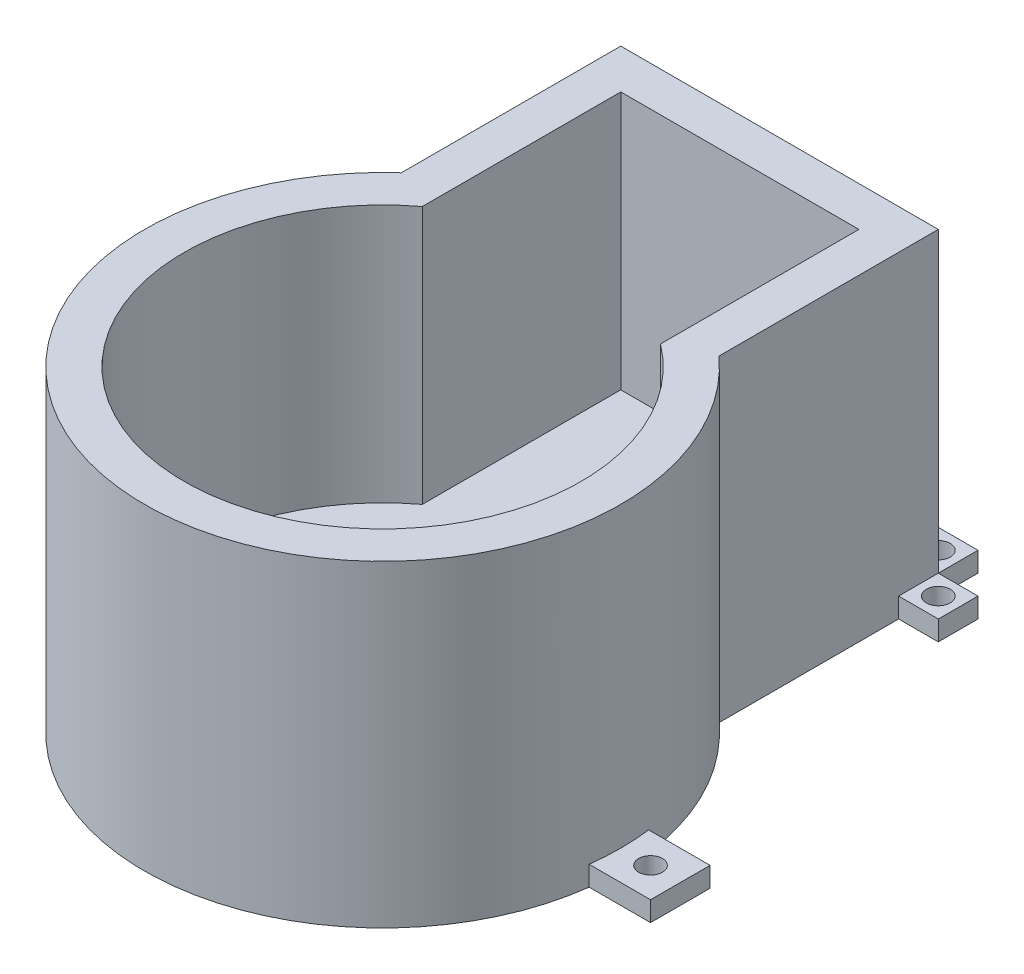
ISO-10303-21;
HEADER;
FILE_DESCRIPTION(('STEP AP214'),'2;1');
FILE_NAME('part.step','',(''),(''),'','','');
FILE_SCHEMA(('AUTOMOTIVE_DESIGN { 1 0 10303 214 1 1 1 1 }'));
ENDSEC;
DATA;
#1=APPLICATION_CONTEXT('core data for automotive mechanical design processes');
#2=APPLICATION_PROTOCOL_DEFINITION('international standard','automotive_design',2000,#1);
#3=PRODUCT_CONTEXT('',#1,'mechanical');
#4=PRODUCT('Part','Part','',(#3));
#5=PRODUCT_RELATED_PRODUCT_CATEGORY('part','',(#4));
#6=PRODUCT_DEFINITION_FORMATION('','',#4);
#7=PRODUCT_DEFINITION_CONTEXT('part definition',#1,'design');
#8=PRODUCT_DEFINITION('design','',#6,#7);
#9=PRODUCT_DEFINITION_SHAPE('','',#8);
#10=(LENGTH_UNIT() NAMED_UNIT(*) SI_UNIT(.MILLI.,.METRE.));
#11=(NAMED_UNIT(*) PLANE_ANGLE_UNIT() SI_UNIT($,.RADIAN.));
#12=(NAMED_UNIT(*) SI_UNIT($,.STERADIAN.) SOLID_ANGLE_UNIT());
#13=UNCERTAINTY_MEASURE_WITH_UNIT(LENGTH_MEASURE(1.E-05),#10,'distance_accuracy_value','');
#14=(GEOMETRIC_REPRESENTATION_CONTEXT(3) GLOBAL_UNCERTAINTY_ASSIGNED_CONTEXT((#13)) GLOBAL_UNIT_ASSIGNED_CONTEXT((#10,
#11,#12)) REPRESENTATION_CONTEXT('',''));
#15=CARTESIAN_POINT('',(0.,0.,0.));
#16=DIRECTION('',(0.,0.,1.));
#17=DIRECTION('',(1.,0.,0.));
#18=AXIS2_PLACEMENT_3D('',#15,#16,#17);
#19=CARTESIAN_POINT('',(40.,80.,0.));
#20=DIRECTION('',(1.,0.,0.));
#21=DIRECTION('',(0.,0.,-1.));
#22=AXIS2_PLACEMENT_3D('',#19,#20,#21);
#23=PLANE('',#22);
#24=DIRECTION('',(0.,0.,1.));
#25=VECTOR('',#24,1.);
#26=CARTESIAN_POINT('',(40.,5.,0.));
#27=LINE('',#26,#25);
#28=CARTESIAN_POINT('',(40.,5.,-50.));
#29=VERTEX_POINT('',#28);
#30=CARTESIAN_POINT('',(40.,5.,-40.));
#31=VERTEX_POINT('',#30);
#32=EDGE_CURVE('E247',#29,#31,#27,.T.);
#33=ORIENTED_EDGE('',*,*,#32,.T.);
#34=DIRECTION('',(0.,-1.,0.));
#35=VECTOR('',#34,1.);
#36=CARTESIAN_POINT('',(40.,5.,-40.));
#37=LINE('',#36,#35);
#38=CARTESIAN_POINT('',(40.,0.,-40.));
#39=VERTEX_POINT('',#38);
#40=EDGE_CURVE('E236',#31,#39,#37,.T.);
#41=ORIENTED_EDGE('',*,*,#40,.T.);
#42=DIRECTION('',(0.,0.,1.));
#43=VECTOR('',#42,1.);
#44=CARTESIAN_POINT('',(40.,0.,0.));
#45=LINE('',#44,#43);
#46=CARTESIAN_POINT('',(40.,0.,-50.));
#47=VERTEX_POINT('',#46);
#48=EDGE_CURVE('E244',#47,#39,#45,.T.);
#49=ORIENTED_EDGE('',*,*,#48,.F.);
#50=DIRECTION('',(0.,-1.,0.));
#51=VECTOR('',#50,1.);
#52=CARTESIAN_POINT('',(40.,5.,-50.));
#53=LINE('',#52,#51);
#54=EDGE_CURVE('E606',#29,#47,#53,.T.);
#55=ORIENTED_EDGE('',*,*,#54,.F.);
#56=EDGE_LOOP('',(#33,#41,#49,#55));
#57=FACE_BOUND('',#56,.T.);
#58=ADVANCED_FACE('F38',(#57),#23,.T.);
#59=CARTESIAN_POINT('',(40.,0.,-30.));
#60=VERTEX_POINT('',#59);
#61=CARTESIAN_POINT('',(40.,0.,15.2786404500042));
#62=VERTEX_POINT('',#61);
#63=EDGE_CURVE('E258',#60,#62,#45,.T.);
#64=ORIENTED_EDGE('',*,*,#63,.F.);
#65=DIRECTION('',(0.,-1.,0.));
#66=VECTOR('',#65,1.);
#67=CARTESIAN_POINT('',(40.,5.,-30.));
#68=LINE('',#67,#66);
#69=CARTESIAN_POINT('',(40.,5.,-30.));
#70=VERTEX_POINT('',#69);
#71=EDGE_CURVE('E311',#70,#60,#68,.T.);
#72=ORIENTED_EDGE('',*,*,#71,.F.);
#73=DIRECTION('',(0.,0.,1.));
#74=VECTOR('',#73,1.);
#75=CARTESIAN_POINT('',(40.,5.,0.));
#76=LINE('',#75,#74);
#77=EDGE_CURVE('E293',#31,#70,#76,.T.);
#78=ORIENTED_EDGE('',*,*,#77,.F.);
#79=DIRECTION('',(0.,-1.,0.));
#80=VECTOR('',#79,1.);
#81=CARTESIAN_POINT('',(40.,80.,-40.));
#82=LINE('',#81,#80);
#83=CARTESIAN_POINT('',(40.,80.,-40.));
#84=VERTEX_POINT('',#83);
#85=EDGE_CURVE('E46',#84,#31,#82,.T.);
#86=ORIENTED_EDGE('',*,*,#85,.F.);
#87=DIRECTION('',(0.,0.,1.));
#88=VECTOR('',#87,1.);
#89=CARTESIAN_POINT('',(40.,80.,0.));
#90=LINE('',#89,#88);
#91=CARTESIAN_POINT('',(40.,80.,15.2786404500042));
#92=VERTEX_POINT('',#91);
#93=EDGE_CURVE('E291',#84,#92,#90,.T.);
#94=ORIENTED_EDGE('',*,*,#93,.T.);
#95=DIRECTION('',(0.,-1.,0.));
#96=VECTOR('',#95,1.);
#97=CARTESIAN_POINT('',(40.,80.,15.2786404500042));
#98=LINE('',#97,#96);
#99=EDGE_CURVE('E11',#92,#62,#98,.T.);
#100=ORIENTED_EDGE('',*,*,#99,.T.);
#101=EDGE_LOOP('',(#64,#72,#78,#86,#94,#100));
#102=FACE_BOUND('',#101,.T.);
#103=ADVANCED_FACE('F290',(#102),#23,.T.);
#104=CARTESIAN_POINT('',(0.,80.,-40.));
#105=DIRECTION('',(0.,0.,-1.));
#106=DIRECTION('',(-1.,0.,0.));
#107=AXIS2_PLACEMENT_3D('',#104,#105,#106);
#108=PLANE('',#107);
#109=DIRECTION('',(1.,0.,0.));
#110=VECTOR('',#109,1.);
#111=CARTESIAN_POINT('',(0.,5.,-40.));
#112=LINE('',#111,#110);
#113=CARTESIAN_POINT('',(-50.,5.,-40.));
#114=VERTEX_POINT('',#113);
#115=CARTESIAN_POINT('',(-40.,5.,-40.));
#116=VERTEX_POINT('',#115);
#117=EDGE_CURVE('E657',#114,#116,#112,.T.);
#118=ORIENTED_EDGE('',*,*,#117,.T.);
#119=DIRECTION('',(0.,-1.,0.));
#120=VECTOR('',#119,1.);
#121=CARTESIAN_POINT('',(-40.,5.,-40.));
#122=LINE('',#121,#120);
#123=CARTESIAN_POINT('',(-40.,0.,-40.));
#124=VERTEX_POINT('',#123);
#125=EDGE_CURVE('E620',#116,#124,#122,.T.);
#126=ORIENTED_EDGE('',*,*,#125,.T.);
#127=DIRECTION('',(1.,0.,0.));
#128=VECTOR('',#127,1.);
#129=CARTESIAN_POINT('',(0.,0.,-40.));
#130=LINE('',#129,#128);
#131=CARTESIAN_POINT('',(-50.,0.,-40.));
#132=VERTEX_POINT('',#131);
#133=EDGE_CURVE('E261',#132,#124,#130,.T.);
#134=ORIENTED_EDGE('',*,*,#133,.F.);
#135=DIRECTION('',(0.,-1.,0.));
#136=VECTOR('',#135,1.);
#137=CARTESIAN_POINT('',(-50.,5.,-40.));
#138=LINE('',#137,#136);
#139=EDGE_CURVE('E671',#114,#132,#138,.T.);
#140=ORIENTED_EDGE('',*,*,#139,.F.);
#141=EDGE_LOOP('',(#118,#126,#134,#140));
#142=FACE_BOUND('',#141,.T.);
#143=ADVANCED_FACE('F446',(#142),#108,.T.);
#144=CARTESIAN_POINT('',(0.,80.,60.));
#145=DIRECTION('',(0.,-1.,0.));
#146=DIRECTION('',(0.,0.,-1.));
#147=AXIS2_PLACEMENT_3D('',#144,#145,#146);
#148=CYLINDRICAL_SURFACE('',#147,60.);
#149=CARTESIAN_POINT('',(0.,5.,60.));
#150=DIRECTION('',(0.,-1.,0.));
#151=DIRECTION('',(0.,0.,-1.));
#152=AXIS2_PLACEMENT_3D('',#149,#150,#151);
#153=CIRCLE('',#152,60.);
#154=CARTESIAN_POINT('',(59.5294044989533,5.,52.5));
#155=VERTEX_POINT('',#154);
#156=CARTESIAN_POINT('',(59.5294044989533,5.,67.5));
#157=VERTEX_POINT('',#156);
#158=EDGE_CURVE('E321',#155,#157,#153,.T.);
#159=ORIENTED_EDGE('',*,*,#158,.F.);
#160=DIRECTION('',(0.,-1.,0.));
#161=VECTOR('',#160,1.);
#162=CARTESIAN_POINT('',(59.5294044989533,5.,52.5));
#163=LINE('',#162,#161);
#164=CARTESIAN_POINT('',(59.5294044989533,0.,52.5));
#165=VERTEX_POINT('',#164);
#166=EDGE_CURVE('E319',#155,#165,#163,.T.);
#167=ORIENTED_EDGE('',*,*,#166,.T.);
#168=CARTESIAN_POINT('',(0.,0.,60.));
#169=DIRECTION('',(0.,1.,0.));
#170=DIRECTION('',(0.,0.,1.));
#171=AXIS2_PLACEMENT_3D('',#168,#169,#170);
#172=CIRCLE('',#171,60.);
#173=EDGE_CURVE('E310',#165,#62,#172,.T.);
#174=ORIENTED_EDGE('',*,*,#173,.T.);
#175=ORIENTED_EDGE('',*,*,#99,.F.);
#176=CARTESIAN_POINT('',(0.,80.,60.));
#177=DIRECTION('',(0.,1.,0.));
#178=DIRECTION('',(0.,0.,1.));
#179=AXIS2_PLACEMENT_3D('',#176,#177,#178);
#180=CIRCLE('',#179,60.);
#181=CARTESIAN_POINT('',(-40.,80.,15.2786404500042));
#182=VERTEX_POINT('',#181);
#183=EDGE_CURVE('E270',#182,#92,#180,.T.);
#184=ORIENTED_EDGE('',*,*,#183,.F.);
#185=DIRECTION('',(0.,-1.,0.));
#186=VECTOR('',#185,1.);
#187=CARTESIAN_POINT('',(-40.,80.,15.2786404500042));
#188=LINE('',#187,#186);
#189=CARTESIAN_POINT('',(-40.,0.,15.2786404500042));
#190=VERTEX_POINT('',#189);
#191=EDGE_CURVE('E271',#182,#190,#188,.T.);
#192=ORIENTED_EDGE('',*,*,#191,.T.);
#193=CARTESIAN_POINT('',(-59.5294044989533,0.,52.5));
#194=VERTEX_POINT('',#193);
#195=EDGE_CURVE('E263',#190,#194,#172,.T.);
#196=ORIENTED_EDGE('',*,*,#195,.T.);
#197=DIRECTION('',(0.,-1.,0.));
#198=VECTOR('',#197,1.);
#199=CARTESIAN_POINT('',(-59.5294044989533,5.,52.5));
#200=LINE('',#199,#198);
#201=CARTESIAN_POINT('',(-59.5294044989533,5.,52.5));
#202=VERTEX_POINT('',#201);
#203=EDGE_CURVE('E382',#202,#194,#200,.T.);
#204=ORIENTED_EDGE('',*,*,#203,.F.);
#205=CARTESIAN_POINT('',(0.,5.,60.));
#206=DIRECTION('',(0.,-1.,0.));
#207=DIRECTION('',(0.,0.,-1.));
#208=AXIS2_PLACEMENT_3D('',#205,#206,#207);
#209=CIRCLE('',#208,60.);
#210=CARTESIAN_POINT('',(-59.5294044989533,5.,67.5));
#211=VERTEX_POINT('',#210);
#212=EDGE_CURVE('E359',#211,#202,#209,.T.);
#213=ORIENTED_EDGE('',*,*,#212,.F.);
#214=DIRECTION('',(0.,-1.,0.));
#215=VECTOR('',#214,1.);
#216=CARTESIAN_POINT('',(-59.5294044989533,5.,67.5));
#217=LINE('',#216,#215);
#218=CARTESIAN_POINT('',(-59.5294044989533,0.,67.5));
#219=VERTEX_POINT('',#218);
#220=EDGE_CURVE('E379',#211,#219,#217,.T.);
#221=ORIENTED_EDGE('',*,*,#220,.T.);
#222=CARTESIAN_POINT('',(59.5294044989533,0.,67.5));
#223=VERTEX_POINT('',#222);
#224=EDGE_CURVE('E316',#219,#223,#172,.T.);
#225=ORIENTED_EDGE('',*,*,#224,.T.);
#226=DIRECTION('',(0.,-1.,0.));
#227=VECTOR('',#226,1.);
#228=CARTESIAN_POINT('',(59.5294044989533,5.,67.5));
#229=LINE('',#228,#227);
#230=EDGE_CURVE('E326',#157,#223,#229,.T.);
#231=ORIENTED_EDGE('',*,*,#230,.F.);
#232=EDGE_LOOP('',(#159,#167,#174,#175,#184,#192,#196,#204,#213,#221,#225,#231));
#233=FACE_BOUND('',#232,.T.);
#234=ADVANCED_FACE('F40',(#233),#148,.T.);
#235=DIRECTION('',(0.,-1.,0.));
#236=VECTOR('',#235,1.);
#237=CARTESIAN_POINT('',(30.,5.,-40.));
#238=LINE('',#237,#236);
#239=CARTESIAN_POINT('',(30.,5.,-40.));
#240=VERTEX_POINT('',#239);
#241=CARTESIAN_POINT('',(30.,0.,-40.));
#242=VERTEX_POINT('',#241);
#243=EDGE_CURVE('E614',#240,#242,#238,.T.);
#244=ORIENTED_EDGE('',*,*,#243,.T.);
#245=CARTESIAN_POINT('',(-30.,0.,-40.));
#246=VERTEX_POINT('',#245);
#247=EDGE_CURVE('E257',#246,#242,#130,.T.);
#248=ORIENTED_EDGE('',*,*,#247,.F.);
#249=DIRECTION('',(0.,-1.,0.));
#250=VECTOR('',#249,1.);
#251=CARTESIAN_POINT('',(-30.,5.,-40.));
#252=LINE('',#251,#250);
#253=CARTESIAN_POINT('',(-30.,5.,-40.));
#254=VERTEX_POINT('',#253);
#255=EDGE_CURVE('E617',#254,#246,#252,.T.);
#256=ORIENTED_EDGE('',*,*,#255,.F.);
#257=DIRECTION('',(1.,0.,0.));
#258=VECTOR('',#257,1.);
#259=CARTESIAN_POINT('',(0.,5.,-40.));
#260=LINE('',#259,#258);
#261=EDGE_CURVE('E632',#116,#254,#260,.T.);
#262=ORIENTED_EDGE('',*,*,#261,.F.);
#263=DIRECTION('',(0.,-1.,0.));
#264=VECTOR('',#263,1.);
#265=CARTESIAN_POINT('',(-40.,80.,-40.));
#266=LINE('',#265,#264);
#267=CARTESIAN_POINT('',(-40.,80.,-40.));
#268=VERTEX_POINT('',#267);
#269=EDGE_CURVE('E274',#268,#116,#266,.T.);
#270=ORIENTED_EDGE('',*,*,#269,.F.);
#271=DIRECTION('',(1.,0.,0.));
#272=VECTOR('',#271,1.);
#273=CARTESIAN_POINT('',(0.,80.,-40.));
#274=LINE('',#273,#272);
#275=EDGE_CURVE('E285',#268,#84,#274,.T.);
#276=ORIENTED_EDGE('',*,*,#275,.T.);
#277=ORIENTED_EDGE('',*,*,#85,.T.);
#278=DIRECTION('',(1.,0.,0.));
#279=VECTOR('',#278,1.);
#280=CARTESIAN_POINT('',(0.,5.,-40.));
#281=LINE('',#280,#279);
#282=EDGE_CURVE('E283',#240,#31,#281,.T.);
#283=ORIENTED_EDGE('',*,*,#282,.F.);
#284=EDGE_LOOP('',(#244,#248,#256,#262,#270,#276,#277,#283));
#285=FACE_BOUND('',#284,.T.);
#286=ADVANCED_FACE('F281',(#285),#108,.T.);
#287=CARTESIAN_POINT('',(-40.,80.,0.));
#288=DIRECTION('',(1.,0.,0.));
#289=DIRECTION('',(0.,0.,-1.));
#290=AXIS2_PLACEMENT_3D('',#287,#288,#289);
#291=PLANE('',#290);
#292=DIRECTION('',(0.,0.,-1.));
#293=VECTOR('',#292,1.);
#294=CARTESIAN_POINT('',(-40.,5.,0.));
#295=LINE('',#294,#293);
#296=CARTESIAN_POINT('',(-40.,5.,-30.));
#297=VERTEX_POINT('',#296);
#298=EDGE_CURVE('E647',#297,#116,#295,.T.);
#299=ORIENTED_EDGE('',*,*,#298,.F.);
#300=DIRECTION('',(0.,-1.,0.));
#301=VECTOR('',#300,1.);
#302=CARTESIAN_POINT('',(-40.,5.,-30.));
#303=LINE('',#302,#301);
#304=CARTESIAN_POINT('',(-40.,0.,-30.));
#305=VERTEX_POINT('',#304);
#306=EDGE_CURVE('E663',#297,#305,#303,.T.);
#307=ORIENTED_EDGE('',*,*,#306,.T.);
#308=DIRECTION('',(0.,0.,1.));
#309=VECTOR('',#308,1.);
#310=CARTESIAN_POINT('',(-40.,0.,0.));
#311=LINE('',#310,#309);
#312=EDGE_CURVE('E268',#305,#190,#311,.T.);
#313=ORIENTED_EDGE('',*,*,#312,.T.);
#314=ORIENTED_EDGE('',*,*,#191,.F.);
#315=DIRECTION('',(0.,0.,1.));
#316=VECTOR('',#315,1.);
#317=CARTESIAN_POINT('',(-40.,80.,0.));
#318=LINE('',#317,#316);
#319=EDGE_CURVE('E275',#268,#182,#318,.T.);
#320=ORIENTED_EDGE('',*,*,#319,.F.);
#321=ORIENTED_EDGE('',*,*,#269,.T.);
#322=EDGE_LOOP('',(#299,#307,#313,#314,#320,#321));
#323=FACE_BOUND('',#322,.T.);
#324=ADVANCED_FACE('F305',(#323),#291,.F.);
#325=CARTESIAN_POINT('',(0.,80.,0.));
#326=DIRECTION('',(0.,1.,0.));
#327=DIRECTION('',(0.,0.,1.));
#328=AXIS2_PLACEMENT_3D('',#325,#326,#327);
#329=PLANE('',#328);
#330=DIRECTION('',(0.,0.,1.));
#331=VECTOR('',#330,1.);
#332=CARTESIAN_POINT('',(-30.,80.,0.));
#333=LINE('',#332,#331);
#334=CARTESIAN_POINT('',(-30.,80.,-30.));
#335=VERTEX_POINT('',#334);
#336=CARTESIAN_POINT('',(-30.,80.,20.));
#337=VERTEX_POINT('',#336);
#338=EDGE_CURVE('E378',#335,#337,#333,.T.);
#339=ORIENTED_EDGE('',*,*,#338,.F.);
#340=DIRECTION('',(1.,0.,0.));
#341=VECTOR('',#340,1.);
#342=CARTESIAN_POINT('',(0.,80.,-30.));
#343=LINE('',#342,#341);
#344=CARTESIAN_POINT('',(30.,80.,-30.));
#345=VERTEX_POINT('',#344);
#346=EDGE_CURVE('E390',#335,#345,#343,.T.);
#347=ORIENTED_EDGE('',*,*,#346,.T.);
#348=DIRECTION('',(0.,0.,1.));
#349=VECTOR('',#348,1.);
#350=CARTESIAN_POINT('',(30.,80.,0.));
#351=LINE('',#350,#349);
#352=CARTESIAN_POINT('',(30.,80.,20.));
#353=VERTEX_POINT('',#352);
#354=EDGE_CURVE('E402',#345,#353,#351,.T.);
#355=ORIENTED_EDGE('',*,*,#354,.T.);
#356=CARTESIAN_POINT('',(0.,80.,60.));
#357=DIRECTION('',(0.,1.,0.));
#358=DIRECTION('',(0.,0.,1.));
#359=AXIS2_PLACEMENT_3D('',#356,#357,#358);
#360=CIRCLE('',#359,50.);
#361=EDGE_CURVE('E399',#337,#353,#360,.T.);
#362=ORIENTED_EDGE('',*,*,#361,.F.);
#363=EDGE_LOOP('',(#339,#347,#355,#362));
#364=FACE_BOUND('',#363,.T.);
#365=ORIENTED_EDGE('',*,*,#183,.T.);
#366=ORIENTED_EDGE('',*,*,#93,.F.);
#367=ORIENTED_EDGE('',*,*,#275,.F.);
#368=ORIENTED_EDGE('',*,*,#319,.T.);
#369=EDGE_LOOP('',(#365,#366,#367,#368));
#370=FACE_BOUND('',#369,.T.);
#371=ADVANCED_FACE('F295',(#364,#370),#329,.T.);
#372=CARTESIAN_POINT('',(0.,0.,0.));
#373=DIRECTION('',(0.,1.,0.));
#374=DIRECTION('',(0.,0.,1.));
#375=AXIS2_PLACEMENT_3D('',#372,#373,#374);
#376=PLANE('',#375);
#377=ORIENTED_EDGE('',*,*,#195,.F.);
#378=ORIENTED_EDGE('',*,*,#312,.F.);
#379=DIRECTION('',(-1.,0.,0.));
#380=VECTOR('',#379,1.);
#381=CARTESIAN_POINT('',(0.,0.,-30.));
#382=LINE('',#381,#380);
#383=CARTESIAN_POINT('',(-50.,0.,-30.));
#384=VERTEX_POINT('',#383);
#385=EDGE_CURVE('E631',#305,#384,#382,.T.);
#386=ORIENTED_EDGE('',*,*,#385,.T.);
#387=DIRECTION('',(0.,0.,-1.));
#388=VECTOR('',#387,1.);
#389=CARTESIAN_POINT('',(-50.,0.,0.));
#390=LINE('',#389,#388);
#391=EDGE_CURVE('E666',#384,#132,#390,.T.);
#392=ORIENTED_EDGE('',*,*,#391,.T.);
#393=ORIENTED_EDGE('',*,*,#133,.T.);
#394=DIRECTION('',(0.,0.,1.));
#395=VECTOR('',#394,1.);
#396=CARTESIAN_POINT('',(-40.,0.,0.));
#397=LINE('',#396,#395);
#398=CARTESIAN_POINT('',(-40.,0.,-50.));
#399=VERTEX_POINT('',#398);
#400=EDGE_CURVE('E61',#399,#124,#397,.T.);
#401=ORIENTED_EDGE('',*,*,#400,.F.);
#402=DIRECTION('',(-1.,0.,0.));
#403=VECTOR('',#402,1.);
#404=CARTESIAN_POINT('',(0.,0.,-50.));
#405=LINE('',#404,#403);
#406=CARTESIAN_POINT('',(-30.,0.,-50.));
#407=VERTEX_POINT('',#406);
#408=EDGE_CURVE('E619',#407,#399,#405,.T.);
#409=ORIENTED_EDGE('',*,*,#408,.F.);
#410=DIRECTION('',(0.,0.,-1.));
#411=VECTOR('',#410,1.);
#412=CARTESIAN_POINT('',(-30.,0.,0.));
#413=LINE('',#412,#411);
#414=EDGE_CURVE('E613',#246,#407,#413,.T.);
#415=ORIENTED_EDGE('',*,*,#414,.F.);
#416=ORIENTED_EDGE('',*,*,#247,.T.);
#417=DIRECTION('',(0.,0.,-1.));
#418=VECTOR('',#417,1.);
#419=CARTESIAN_POINT('',(30.,0.,0.));
#420=LINE('',#419,#418);
#421=CARTESIAN_POINT('',(30.,0.,-50.));
#422=VERTEX_POINT('',#421);
#423=EDGE_CURVE('E598',#242,#422,#420,.T.);
#424=ORIENTED_EDGE('',*,*,#423,.T.);
#425=DIRECTION('',(1.,0.,0.));
#426=VECTOR('',#425,1.);
#427=CARTESIAN_POINT('',(0.,0.,-50.));
#428=LINE('',#427,#426);
#429=EDGE_CURVE('E256',#422,#47,#428,.T.);
#430=ORIENTED_EDGE('',*,*,#429,.T.);
#431=ORIENTED_EDGE('',*,*,#48,.T.);
#432=DIRECTION('',(-1.,0.,0.));
#433=VECTOR('',#432,1.);
#434=CARTESIAN_POINT('',(0.,0.,-40.));
#435=LINE('',#434,#433);
#436=CARTESIAN_POINT('',(50.,0.,-40.));
#437=VERTEX_POINT('',#436);
#438=EDGE_CURVE('E232',#437,#39,#435,.T.);
#439=ORIENTED_EDGE('',*,*,#438,.F.);
#440=DIRECTION('',(0.,0.,-1.));
#441=VECTOR('',#440,1.);
#442=CARTESIAN_POINT('',(50.,0.,0.));
#443=LINE('',#442,#441);
#444=CARTESIAN_POINT('',(50.,0.,-30.));
#445=VERTEX_POINT('',#444);
#446=EDGE_CURVE('E579',#445,#437,#443,.T.);
#447=ORIENTED_EDGE('',*,*,#446,.F.);
#448=DIRECTION('',(1.,0.,0.));
#449=VECTOR('',#448,1.);
#450=CARTESIAN_POINT('',(0.,0.,-30.));
#451=LINE('',#450,#449);
#452=EDGE_CURVE('E53',#60,#445,#451,.T.);
#453=ORIENTED_EDGE('',*,*,#452,.F.);
#454=ORIENTED_EDGE('',*,*,#63,.T.);
#455=ORIENTED_EDGE('',*,*,#173,.F.);
#456=DIRECTION('',(1.,0.,0.));
#457=VECTOR('',#456,1.);
#458=CARTESIAN_POINT('',(0.,0.,52.5));
#459=LINE('',#458,#457);
#460=CARTESIAN_POINT('',(75.,0.,52.5));
#461=VERTEX_POINT('',#460);
#462=EDGE_CURVE('E315',#165,#461,#459,.T.);
#463=ORIENTED_EDGE('',*,*,#462,.T.);
#464=DIRECTION('',(0.,0.,-1.));
#465=VECTOR('',#464,1.);
#466=CARTESIAN_POINT('',(75.,0.,0.));
#467=LINE('',#466,#465);
#468=CARTESIAN_POINT('',(75.,0.,67.5));
#469=VERTEX_POINT('',#468);
#470=EDGE_CURVE('E337',#469,#461,#467,.T.);
#471=ORIENTED_EDGE('',*,*,#470,.F.);
#472=DIRECTION('',(1.,0.,0.));
#473=VECTOR('',#472,1.);
#474=CARTESIAN_POINT('',(0.,0.,67.5));
#475=LINE('',#474,#473);
#476=EDGE_CURVE('E332',#223,#469,#475,.T.);
#477=ORIENTED_EDGE('',*,*,#476,.F.);
#478=ORIENTED_EDGE('',*,*,#224,.F.);
#479=DIRECTION('',(1.,0.,0.));
#480=VECTOR('',#479,1.);
#481=CARTESIAN_POINT('',(0.,0.,67.5));
#482=LINE('',#481,#480);
#483=CARTESIAN_POINT('',(-75.,0.,67.5));
#484=VERTEX_POINT('',#483);
#485=EDGE_CURVE('E353',#484,#219,#482,.T.);
#486=ORIENTED_EDGE('',*,*,#485,.F.);
#487=DIRECTION('',(0.,0.,-1.));
#488=VECTOR('',#487,1.);
#489=CARTESIAN_POINT('',(-75.,0.,0.));
#490=LINE('',#489,#488);
#491=CARTESIAN_POINT('',(-75.,0.,52.5));
#492=VERTEX_POINT('',#491);
#493=EDGE_CURVE('E368',#484,#492,#490,.T.);
#494=ORIENTED_EDGE('',*,*,#493,.T.);
#495=DIRECTION('',(1.,0.,0.));
#496=VECTOR('',#495,1.);
#497=CARTESIAN_POINT('',(0.,0.,52.5));
#498=LINE('',#497,#496);
#499=EDGE_CURVE('E371',#492,#194,#498,.T.);
#500=ORIENTED_EDGE('',*,*,#499,.T.);
#501=EDGE_LOOP('',(#377,#378,#386,#392,#393,#401,#409,#415,#416,#424,#430,#431,#439,#447,#453,
#454,#455,#463,#471,#477,#478,#486,#494,#500));
#502=FACE_BOUND('',#501,.T.);
#503=CARTESIAN_POINT('',(-67.5,0.,59.9999999999998));
#504=DIRECTION('',(0.,-1.,0.));
#505=DIRECTION('',(0.,0.,-1.));
#506=AXIS2_PLACEMENT_3D('',#503,#504,#505);
#507=CIRCLE('',#506,3.00000000000001);
#508=CARTESIAN_POINT('',(-67.5,0.,56.9999999999998));
#509=VERTEX_POINT('',#508);
#510=EDGE_CURVE('E341',#509,#509,#507,.T.);
#511=ORIENTED_EDGE('',*,*,#510,.F.);
#512=EDGE_LOOP('',(#511));
#513=FACE_BOUND('',#512,.T.);
#514=CARTESIAN_POINT('',(67.5,0.,59.9999999999998));
#515=DIRECTION('',(0.,-1.,0.));
#516=DIRECTION('',(0.,0.,-1.));
#517=AXIS2_PLACEMENT_3D('',#514,#515,#516);
#518=CIRCLE('',#517,3.00000000000001);
#519=CARTESIAN_POINT('',(67.5,0.,56.9999999999998));
#520=VERTEX_POINT('',#519);
#521=EDGE_CURVE('E331',#520,#520,#518,.F.);
#522=ORIENTED_EDGE('',*,*,#521,.T.);
#523=EDGE_LOOP('',(#522));
#524=FACE_BOUND('',#523,.T.);
#525=CARTESIAN_POINT('',(-45.,0.,-35.));
#526=DIRECTION('',(0.,-1.,0.));
#527=DIRECTION('',(0.,0.,-1.));
#528=AXIS2_PLACEMENT_3D('',#525,#526,#527);
#529=CIRCLE('',#528,3.);
#530=CARTESIAN_POINT('',(-45.,0.,-38.));
#531=VERTEX_POINT('',#530);
#532=EDGE_CURVE('E651',#531,#531,#529,.F.);
#533=ORIENTED_EDGE('',*,*,#532,.T.);
#534=EDGE_LOOP('',(#533));
#535=FACE_BOUND('',#534,.T.);
#536=CARTESIAN_POINT('',(-35.,0.,-45.));
#537=DIRECTION('',(0.,-1.,0.));
#538=DIRECTION('',(0.,0.,-1.));
#539=AXIS2_PLACEMENT_3D('',#536,#537,#538);
#540=CIRCLE('',#539,3.);
#541=CARTESIAN_POINT('',(-35.,0.,-48.));
#542=VERTEX_POINT('',#541);
#543=EDGE_CURVE('E628',#542,#542,#540,.F.);
#544=ORIENTED_EDGE('',*,*,#543,.T.);
#545=EDGE_LOOP('',(#544));
#546=FACE_BOUND('',#545,.T.);
#547=CARTESIAN_POINT('',(35.,0.,-45.));
#548=DIRECTION('',(0.,-1.,0.));
#549=DIRECTION('',(0.,0.,-1.));
#550=AXIS2_PLACEMENT_3D('',#547,#548,#549);
#551=CIRCLE('',#550,3.);
#552=CARTESIAN_POINT('',(35.,0.,-48.));
#553=VERTEX_POINT('',#552);
#554=EDGE_CURVE('E591',#553,#553,#551,.T.);
#555=ORIENTED_EDGE('',*,*,#554,.F.);
#556=EDGE_LOOP('',(#555));
#557=FACE_BOUND('',#556,.T.);
#558=CARTESIAN_POINT('',(45.,0.,-35.));
#559=DIRECTION('',(0.,-1.,0.));
#560=DIRECTION('',(0.,0.,-1.));
#561=AXIS2_PLACEMENT_3D('',#558,#559,#560);
#562=CIRCLE('',#561,3.);
#563=CARTESIAN_POINT('',(45.,0.,-38.));
#564=VERTEX_POINT('',#563);
#565=EDGE_CURVE('E577',#564,#564,#562,.T.);
#566=ORIENTED_EDGE('',*,*,#565,.F.);
#567=EDGE_LOOP('',(#566));
#568=FACE_BOUND('',#567,.T.);
#569=ADVANCED_FACE('F252',(#502,#513,#524,#535,#546,#557,#568),#376,.F.);
#570=CARTESIAN_POINT('',(-30.,15.,0.));
#571=DIRECTION('',(-1.,0.,0.));
#572=DIRECTION('',(0.,0.,1.));
#573=AXIS2_PLACEMENT_3D('',#570,#571,#572);
#574=PLANE('',#573);
#575=ORIENTED_EDGE('',*,*,#338,.T.);
#576=DIRECTION('',(0.,1.,0.));
#577=VECTOR('',#576,1.);
#578=CARTESIAN_POINT('',(-30.,15.,20.));
#579=LINE('',#578,#577);
#580=CARTESIAN_POINT('',(-30.,15.,20.));
#581=VERTEX_POINT('',#580);
#582=EDGE_CURVE('E397',#581,#337,#579,.T.);
#583=ORIENTED_EDGE('',*,*,#582,.F.);
#584=DIRECTION('',(0.,0.,1.));
#585=VECTOR('',#584,1.);
#586=CARTESIAN_POINT('',(-30.,15.,0.));
#587=LINE('',#586,#585);
#588=CARTESIAN_POINT('',(-30.,15.,-30.));
#589=VERTEX_POINT('',#588);
#590=EDGE_CURVE('E386',#589,#581,#587,.T.);
#591=ORIENTED_EDGE('',*,*,#590,.F.);
#592=DIRECTION('',(0.,1.,0.));
#593=VECTOR('',#592,1.);
#594=CARTESIAN_POINT('',(-30.,15.,-30.));
#595=LINE('',#594,#593);
#596=EDGE_CURVE('E317',#589,#335,#595,.T.);
#597=ORIENTED_EDGE('',*,*,#596,.T.);
#598=EDGE_LOOP('',(#575,#583,#591,#597));
#599=FACE_BOUND('',#598,.T.);
#600=ADVANCED_FACE('F430',(#599),#574,.F.);
#601=CARTESIAN_POINT('',(0.,15.,-30.));
#602=DIRECTION('',(0.,0.,1.));
#603=DIRECTION('',(1.,0.,0.));
#604=AXIS2_PLACEMENT_3D('',#601,#602,#603);
#605=PLANE('',#604);
#606=ORIENTED_EDGE('',*,*,#346,.F.);
#607=ORIENTED_EDGE('',*,*,#596,.F.);
#608=DIRECTION('',(1.,0.,0.));
#609=VECTOR('',#608,1.);
#610=CARTESIAN_POINT('',(0.,15.,-30.));
#611=LINE('',#610,#609);
#612=CARTESIAN_POINT('',(30.,15.,-30.));
#613=VERTEX_POINT('',#612);
#614=EDGE_CURVE('E395',#589,#613,#611,.T.);
#615=ORIENTED_EDGE('',*,*,#614,.T.);
#616=DIRECTION('',(0.,1.,0.));
#617=VECTOR('',#616,1.);
#618=CARTESIAN_POINT('',(30.,15.,-30.));
#619=LINE('',#618,#617);
#620=EDGE_CURVE('E408',#613,#345,#619,.T.);
#621=ORIENTED_EDGE('',*,*,#620,.T.);
#622=EDGE_LOOP('',(#606,#607,#615,#621));
#623=FACE_BOUND('',#622,.T.);
#624=ADVANCED_FACE('F432',(#623),#605,.T.);
#625=CARTESIAN_POINT('',(30.,15.,0.));
#626=DIRECTION('',(-1.,0.,0.));
#627=DIRECTION('',(0.,0.,1.));
#628=AXIS2_PLACEMENT_3D('',#625,#626,#627);
#629=PLANE('',#628);
#630=ORIENTED_EDGE('',*,*,#354,.F.);
#631=ORIENTED_EDGE('',*,*,#620,.F.);
#632=DIRECTION('',(0.,0.,1.));
#633=VECTOR('',#632,1.);
#634=CARTESIAN_POINT('',(30.,15.,0.));
#635=LINE('',#634,#633);
#636=CARTESIAN_POINT('',(30.,15.,20.));
#637=VERTEX_POINT('',#636);
#638=EDGE_CURVE('E393',#613,#637,#635,.T.);
#639=ORIENTED_EDGE('',*,*,#638,.T.);
#640=DIRECTION('',(0.,1.,0.));
#641=VECTOR('',#640,1.);
#642=CARTESIAN_POINT('',(30.,15.,20.));
#643=LINE('',#642,#641);
#644=EDGE_CURVE('E410',#637,#353,#643,.T.);
#645=ORIENTED_EDGE('',*,*,#644,.T.);
#646=EDGE_LOOP('',(#630,#631,#639,#645));
#647=FACE_BOUND('',#646,.T.);
#648=ADVANCED_FACE('F425',(#647),#629,.T.);
#649=CARTESIAN_POINT('',(0.,15.,60.));
#650=DIRECTION('',(0.,1.,0.));
#651=DIRECTION('',(0.,0.,1.));
#652=AXIS2_PLACEMENT_3D('',#649,#650,#651);
#653=CYLINDRICAL_SURFACE('',#652,50.);
#654=ORIENTED_EDGE('',*,*,#361,.T.);
#655=ORIENTED_EDGE('',*,*,#644,.F.);
#656=CARTESIAN_POINT('',(0.,15.,60.));
#657=DIRECTION('',(0.,1.,0.));
#658=DIRECTION('',(0.,0.,1.));
#659=AXIS2_PLACEMENT_3D('',#656,#657,#658);
#660=CIRCLE('',#659,50.);
#661=EDGE_CURVE('E389',#581,#637,#660,.T.);
#662=ORIENTED_EDGE('',*,*,#661,.F.);
#663=ORIENTED_EDGE('',*,*,#582,.T.);
#664=EDGE_LOOP('',(#654,#655,#662,#663));
#665=FACE_BOUND('',#664,.T.);
#666=ADVANCED_FACE('F415',(#665),#653,.F.);
#667=CARTESIAN_POINT('',(0.,15.,0.));
#668=DIRECTION('',(0.,1.,0.));
#669=DIRECTION('',(0.,0.,1.));
#670=AXIS2_PLACEMENT_3D('',#667,#668,#669);
#671=PLANE('',#670);
#672=ORIENTED_EDGE('',*,*,#590,.T.);
#673=ORIENTED_EDGE('',*,*,#661,.T.);
#674=ORIENTED_EDGE('',*,*,#638,.F.);
#675=ORIENTED_EDGE('',*,*,#614,.F.);
#676=EDGE_LOOP('',(#672,#673,#674,#675));
#677=FACE_BOUND('',#676,.T.);
#678=ADVANCED_FACE('F428',(#677),#671,.T.);
#679=CARTESIAN_POINT('',(-75.,5.,0.));
#680=DIRECTION('',(-1.,0.,0.));
#681=DIRECTION('',(0.,0.,1.));
#682=AXIS2_PLACEMENT_3D('',#679,#680,#681);
#683=PLANE('',#682);
#684=ORIENTED_EDGE('',*,*,#493,.F.);
#685=DIRECTION('',(0.,-1.,0.));
#686=VECTOR('',#685,1.);
#687=CARTESIAN_POINT('',(-75.,5.,67.5));
#688=LINE('',#687,#686);
#689=CARTESIAN_POINT('',(-75.,5.,67.5));
#690=VERTEX_POINT('',#689);
#691=EDGE_CURVE('E376',#690,#484,#688,.T.);
#692=ORIENTED_EDGE('',*,*,#691,.F.);
#693=DIRECTION('',(0.,0.,-1.));
#694=VECTOR('',#693,1.);
#695=CARTESIAN_POINT('',(-75.,5.,0.));
#696=LINE('',#695,#694);
#697=CARTESIAN_POINT('',(-75.,5.,52.5));
#698=VERTEX_POINT('',#697);
#699=EDGE_CURVE('E352',#690,#698,#696,.T.);
#700=ORIENTED_EDGE('',*,*,#699,.T.);
#701=DIRECTION('',(0.,-1.,0.));
#702=VECTOR('',#701,1.);
#703=CARTESIAN_POINT('',(-75.,5.,52.5));
#704=LINE('',#703,#702);
#705=EDGE_CURVE('E365',#698,#492,#704,.T.);
#706=ORIENTED_EDGE('',*,*,#705,.T.);
#707=EDGE_LOOP('',(#684,#692,#700,#706));
#708=FACE_BOUND('',#707,.T.);
#709=ADVANCED_FACE('F460',(#708),#683,.T.);
#710=CARTESIAN_POINT('',(0.,5.,67.5));
#711=DIRECTION('',(0.,0.,-1.));
#712=DIRECTION('',(-1.,0.,0.));
#713=AXIS2_PLACEMENT_3D('',#710,#711,#712);
#714=PLANE('',#713);
#715=ORIENTED_EDGE('',*,*,#485,.T.);
#716=ORIENTED_EDGE('',*,*,#220,.F.);
#717=DIRECTION('',(1.,0.,0.));
#718=VECTOR('',#717,1.);
#719=CARTESIAN_POINT('',(0.,5.,67.5));
#720=LINE('',#719,#718);
#721=EDGE_CURVE('E362',#690,#211,#720,.T.);
#722=ORIENTED_EDGE('',*,*,#721,.F.);
#723=ORIENTED_EDGE('',*,*,#691,.T.);
#724=EDGE_LOOP('',(#715,#716,#722,#723));
#725=FACE_BOUND('',#724,.T.);
#726=ADVANCED_FACE('F464',(#725),#714,.F.);
#727=CARTESIAN_POINT('',(-67.5,5.,59.9999999999998));
#728=DIRECTION('',(0.,-1.,0.));
#729=DIRECTION('',(0.,0.,-1.));
#730=AXIS2_PLACEMENT_3D('',#727,#728,#729);
#731=CYLINDRICAL_SURFACE('',#730,3.00000000000001);
#732=CARTESIAN_POINT('',(-67.5,5.,59.9999999999998));
#733=DIRECTION('',(0.,-1.,0.));
#734=DIRECTION('',(0.,0.,-1.));
#735=AXIS2_PLACEMENT_3D('',#732,#733,#734);
#736=CIRCLE('',#735,3.00000000000001);
#737=CARTESIAN_POINT('',(-67.5,5.,56.9999999999998));
#738=VERTEX_POINT('',#737);
#739=EDGE_CURVE('E349',#738,#738,#736,.T.);
#740=ORIENTED_EDGE('',*,*,#739,.F.);
#741=EDGE_LOOP('',(#740));
#742=FACE_BOUND('',#741,.T.);
#743=ORIENTED_EDGE('',*,*,#510,.T.);
#744=EDGE_LOOP('',(#743));
#745=FACE_BOUND('',#744,.T.);
#746=ADVANCED_FACE('F468',(#742,#745),#731,.F.);
#747=CARTESIAN_POINT('',(0.,5.,52.5));
#748=DIRECTION('',(0.,0.,-1.));
#749=DIRECTION('',(-1.,0.,0.));
#750=AXIS2_PLACEMENT_3D('',#747,#748,#749);
#751=PLANE('',#750);
#752=ORIENTED_EDGE('',*,*,#499,.F.);
#753=ORIENTED_EDGE('',*,*,#705,.F.);
#754=DIRECTION('',(1.,0.,0.));
#755=VECTOR('',#754,1.);
#756=CARTESIAN_POINT('',(0.,5.,52.5));
#757=LINE('',#756,#755);
#758=EDGE_CURVE('E356',#698,#202,#757,.T.);
#759=ORIENTED_EDGE('',*,*,#758,.T.);
#760=ORIENTED_EDGE('',*,*,#203,.T.);
#761=EDGE_LOOP('',(#752,#753,#759,#760));
#762=FACE_BOUND('',#761,.T.);
#763=ADVANCED_FACE('F470',(#762),#751,.T.);
#764=CARTESIAN_POINT('',(0.,5.,0.));
#765=DIRECTION('',(0.,-1.,0.));
#766=DIRECTION('',(0.,0.,-1.));
#767=AXIS2_PLACEMENT_3D('',#764,#765,#766);
#768=PLANE('',#767);
#769=ORIENTED_EDGE('',*,*,#739,.T.);
#770=EDGE_LOOP('',(#769));
#771=FACE_BOUND('',#770,.T.);
#772=ORIENTED_EDGE('',*,*,#699,.F.);
#773=ORIENTED_EDGE('',*,*,#721,.T.);
#774=ORIENTED_EDGE('',*,*,#212,.T.);
#775=ORIENTED_EDGE('',*,*,#758,.F.);
#776=EDGE_LOOP('',(#772,#773,#774,#775));
#777=FACE_BOUND('',#776,.T.);
#778=ADVANCED_FACE('F475',(#771,#777),#768,.F.);
#779=CARTESIAN_POINT('',(75.,5.,0.));
#780=DIRECTION('',(-1.,0.,0.));
#781=DIRECTION('',(0.,0.,1.));
#782=AXIS2_PLACEMENT_3D('',#779,#780,#781);
#783=PLANE('',#782);
#784=ORIENTED_EDGE('',*,*,#470,.T.);
#785=DIRECTION('',(0.,-1.,0.));
#786=VECTOR('',#785,1.);
#787=CARTESIAN_POINT('',(75.,5.,52.5));
#788=LINE('',#787,#786);
#789=CARTESIAN_POINT('',(75.,5.,52.5));
#790=VERTEX_POINT('',#789);
#791=EDGE_CURVE('E325',#790,#461,#788,.T.);
#792=ORIENTED_EDGE('',*,*,#791,.F.);
#793=DIRECTION('',(0.,0.,-1.));
#794=VECTOR('',#793,1.);
#795=CARTESIAN_POINT('',(75.,5.,0.));
#796=LINE('',#795,#794);
#797=CARTESIAN_POINT('',(75.,5.,67.5));
#798=VERTEX_POINT('',#797);
#799=EDGE_CURVE('E335',#798,#790,#796,.T.);
#800=ORIENTED_EDGE('',*,*,#799,.F.);
#801=DIRECTION('',(0.,-1.,0.));
#802=VECTOR('',#801,1.);
#803=CARTESIAN_POINT('',(75.,5.,67.5));
#804=LINE('',#803,#802);
#805=EDGE_CURVE('E345',#798,#469,#804,.T.);
#806=ORIENTED_EDGE('',*,*,#805,.T.);
#807=EDGE_LOOP('',(#784,#792,#800,#806));
#808=FACE_BOUND('',#807,.T.);
#809=ADVANCED_FACE('F482',(#808),#783,.F.);
#810=CARTESIAN_POINT('',(0.,5.,52.5));
#811=DIRECTION('',(0.,0.,-1.));
#812=DIRECTION('',(-1.,0.,0.));
#813=AXIS2_PLACEMENT_3D('',#810,#811,#812);
#814=PLANE('',#813);
#815=ORIENTED_EDGE('',*,*,#462,.F.);
#816=ORIENTED_EDGE('',*,*,#166,.F.);
#817=DIRECTION('',(1.,0.,0.));
#818=VECTOR('',#817,1.);
#819=CARTESIAN_POINT('',(0.,5.,52.5));
#820=LINE('',#819,#818);
#821=EDGE_CURVE('E681',#155,#790,#820,.T.);
#822=ORIENTED_EDGE('',*,*,#821,.T.);
#823=ORIENTED_EDGE('',*,*,#791,.T.);
#824=EDGE_LOOP('',(#815,#816,#822,#823));
#825=FACE_BOUND('',#824,.T.);
#826=ADVANCED_FACE('F328',(#825),#814,.T.);
#827=CARTESIAN_POINT('',(0.,5.,67.5));
#828=DIRECTION('',(0.,0.,-1.));
#829=DIRECTION('',(-1.,0.,0.));
#830=AXIS2_PLACEMENT_3D('',#827,#828,#829);
#831=PLANE('',#830);
#832=ORIENTED_EDGE('',*,*,#476,.T.);
#833=ORIENTED_EDGE('',*,*,#805,.F.);
#834=DIRECTION('',(1.,0.,0.));
#835=VECTOR('',#834,1.);
#836=CARTESIAN_POINT('',(0.,5.,67.5));
#837=LINE('',#836,#835);
#838=EDGE_CURVE('E678',#157,#798,#837,.T.);
#839=ORIENTED_EDGE('',*,*,#838,.F.);
#840=ORIENTED_EDGE('',*,*,#230,.T.);
#841=EDGE_LOOP('',(#832,#833,#839,#840));
#842=FACE_BOUND('',#841,.T.);
#843=ADVANCED_FACE('F487',(#842),#831,.F.);
#844=CARTESIAN_POINT('',(67.5,5.,59.9999999999998));
#845=DIRECTION('',(0.,-1.,0.));
#846=DIRECTION('',(0.,0.,-1.));
#847=AXIS2_PLACEMENT_3D('',#844,#845,#846);
#848=CYLINDRICAL_SURFACE('',#847,3.00000000000001);
#849=CARTESIAN_POINT('',(67.5,5.,59.9999999999998));
#850=DIRECTION('',(0.,-1.,0.));
#851=DIRECTION('',(0.,0.,-1.));
#852=AXIS2_PLACEMENT_3D('',#849,#850,#851);
#853=CIRCLE('',#852,3.00000000000001);
#854=CARTESIAN_POINT('',(67.5,5.,56.9999999999998));
#855=VERTEX_POINT('',#854);
#856=EDGE_CURVE('E348',#855,#855,#853,.F.);
#857=ORIENTED_EDGE('',*,*,#856,.T.);
#858=EDGE_LOOP('',(#857));
#859=FACE_BOUND('',#858,.T.);
#860=ORIENTED_EDGE('',*,*,#521,.F.);
#861=EDGE_LOOP('',(#860));
#862=FACE_BOUND('',#861,.T.);
#863=ADVANCED_FACE('F490',(#859,#862),#848,.F.);
#864=CARTESIAN_POINT('',(0.,5.,0.));
#865=DIRECTION('',(0.,-1.,0.));
#866=DIRECTION('',(0.,0.,-1.));
#867=AXIS2_PLACEMENT_3D('',#864,#865,#866);
#868=PLANE('',#867);
#869=ORIENTED_EDGE('',*,*,#799,.T.);
#870=ORIENTED_EDGE('',*,*,#821,.F.);
#871=ORIENTED_EDGE('',*,*,#158,.T.);
#872=ORIENTED_EDGE('',*,*,#838,.T.);
#873=EDGE_LOOP('',(#869,#870,#871,#872));
#874=FACE_BOUND('',#873,.T.);
#875=ORIENTED_EDGE('',*,*,#856,.F.);
#876=EDGE_LOOP('',(#875));
#877=FACE_BOUND('',#876,.T.);
#878=ADVANCED_FACE('F496',(#874,#877),#868,.F.);
#879=CARTESIAN_POINT('',(-50.,5.,0.));
#880=DIRECTION('',(-1.,0.,0.));
#881=DIRECTION('',(0.,0.,1.));
#882=AXIS2_PLACEMENT_3D('',#879,#880,#881);
#883=PLANE('',#882);
#884=ORIENTED_EDGE('',*,*,#391,.F.);
#885=DIRECTION('',(0.,-1.,0.));
#886=VECTOR('',#885,1.);
#887=CARTESIAN_POINT('',(-50.,5.,-30.));
#888=LINE('',#887,#886);
#889=CARTESIAN_POINT('',(-50.,5.,-30.));
#890=VERTEX_POINT('',#889);
#891=EDGE_CURVE('E674',#890,#384,#888,.T.);
#892=ORIENTED_EDGE('',*,*,#891,.F.);
#893=DIRECTION('',(0.,0.,-1.));
#894=VECTOR('',#893,1.);
#895=CARTESIAN_POINT('',(-50.,5.,0.));
#896=LINE('',#895,#894);
#897=EDGE_CURVE('E654',#890,#114,#896,.T.);
#898=ORIENTED_EDGE('',*,*,#897,.T.);
#899=ORIENTED_EDGE('',*,*,#139,.T.);
#900=EDGE_LOOP('',(#884,#892,#898,#899));
#901=FACE_BOUND('',#900,.T.);
#902=ADVANCED_FACE('F500',(#901),#883,.T.);
#903=CARTESIAN_POINT('',(0.,5.,-30.));
#904=DIRECTION('',(0.,0.,1.));
#905=DIRECTION('',(1.,0.,0.));
#906=AXIS2_PLACEMENT_3D('',#903,#904,#905);
#907=PLANE('',#906);
#908=ORIENTED_EDGE('',*,*,#385,.F.);
#909=ORIENTED_EDGE('',*,*,#306,.F.);
#910=DIRECTION('',(-1.,0.,0.));
#911=VECTOR('',#910,1.);
#912=CARTESIAN_POINT('',(0.,5.,-30.));
#913=LINE('',#912,#911);
#914=EDGE_CURVE('E650',#297,#890,#913,.T.);
#915=ORIENTED_EDGE('',*,*,#914,.T.);
#916=ORIENTED_EDGE('',*,*,#891,.T.);
#917=EDGE_LOOP('',(#908,#909,#915,#916));
#918=FACE_BOUND('',#917,.T.);
#919=ADVANCED_FACE('F502',(#918),#907,.T.);
#920=CARTESIAN_POINT('',(-45.,5.,-35.));
#921=DIRECTION('',(0.,-1.,0.));
#922=DIRECTION('',(0.,0.,-1.));
#923=AXIS2_PLACEMENT_3D('',#920,#921,#922);
#924=CYLINDRICAL_SURFACE('',#923,3.);
#925=CARTESIAN_POINT('',(-45.,5.,-35.));
#926=DIRECTION('',(0.,-1.,0.));
#927=DIRECTION('',(0.,0.,-1.));
#928=AXIS2_PLACEMENT_3D('',#925,#926,#927);
#929=CIRCLE('',#928,3.);
#930=CARTESIAN_POINT('',(-45.,5.,-38.));
#931=VERTEX_POINT('',#930);
#932=EDGE_CURVE('E660',#931,#931,#929,.F.);
#933=ORIENTED_EDGE('',*,*,#932,.T.);
#934=EDGE_LOOP('',(#933));
#935=FACE_BOUND('',#934,.T.);
#936=ORIENTED_EDGE('',*,*,#532,.F.);
#937=EDGE_LOOP('',(#936));
#938=FACE_BOUND('',#937,.T.);
#939=ADVANCED_FACE('F505',(#935,#938),#924,.F.);
#940=CARTESIAN_POINT('',(0.,5.,0.));
#941=DIRECTION('',(0.,-1.,0.));
#942=DIRECTION('',(0.,0.,-1.));
#943=AXIS2_PLACEMENT_3D('',#940,#941,#942);
#944=PLANE('',#943);
#945=ORIENTED_EDGE('',*,*,#298,.T.);
#946=ORIENTED_EDGE('',*,*,#117,.F.);
#947=ORIENTED_EDGE('',*,*,#897,.F.);
#948=ORIENTED_EDGE('',*,*,#914,.F.);
#949=EDGE_LOOP('',(#945,#946,#947,#948));
#950=FACE_BOUND('',#949,.T.);
#951=ORIENTED_EDGE('',*,*,#932,.F.);
#952=EDGE_LOOP('',(#951));
#953=FACE_BOUND('',#952,.T.);
#954=ADVANCED_FACE('F512',(#950,#953),#944,.F.);
#955=CARTESIAN_POINT('',(-30.,5.,0.));
#956=DIRECTION('',(-1.,0.,0.));
#957=DIRECTION('',(0.,0.,1.));
#958=AXIS2_PLACEMENT_3D('',#955,#956,#957);
#959=PLANE('',#958);
#960=ORIENTED_EDGE('',*,*,#414,.T.);
#961=DIRECTION('',(0.,-1.,0.));
#962=VECTOR('',#961,1.);
#963=CARTESIAN_POINT('',(-30.,5.,-50.));
#964=LINE('',#963,#962);
#965=CARTESIAN_POINT('',(-30.,5.,-50.));
#966=VERTEX_POINT('',#965);
#967=EDGE_CURVE('E625',#966,#407,#964,.T.);
#968=ORIENTED_EDGE('',*,*,#967,.F.);
#969=DIRECTION('',(0.,0.,-1.));
#970=VECTOR('',#969,1.);
#971=CARTESIAN_POINT('',(-30.,5.,0.));
#972=LINE('',#971,#970);
#973=EDGE_CURVE('E639',#254,#966,#972,.T.);
#974=ORIENTED_EDGE('',*,*,#973,.F.);
#975=ORIENTED_EDGE('',*,*,#255,.T.);
#976=EDGE_LOOP('',(#960,#968,#974,#975));
#977=FACE_BOUND('',#976,.T.);
#978=ADVANCED_FACE('F516',(#977),#959,.F.);
#979=CARTESIAN_POINT('',(0.,5.,-50.));
#980=DIRECTION('',(0.,0.,1.));
#981=DIRECTION('',(1.,0.,0.));
#982=AXIS2_PLACEMENT_3D('',#979,#980,#981);
#983=PLANE('',#982);
#984=ORIENTED_EDGE('',*,*,#408,.T.);
#985=DIRECTION('',(0.,-1.,0.));
#986=VECTOR('',#985,1.);
#987=CARTESIAN_POINT('',(-40.,5.,-50.));
#988=LINE('',#987,#986);
#989=CARTESIAN_POINT('',(-40.,5.,-50.));
#990=VERTEX_POINT('',#989);
#991=EDGE_CURVE('E623',#990,#399,#988,.T.);
#992=ORIENTED_EDGE('',*,*,#991,.F.);
#993=DIRECTION('',(-1.,0.,0.));
#994=VECTOR('',#993,1.);
#995=CARTESIAN_POINT('',(0.,5.,-50.));
#996=LINE('',#995,#994);
#997=EDGE_CURVE('E640',#966,#990,#996,.T.);
#998=ORIENTED_EDGE('',*,*,#997,.F.);
#999=ORIENTED_EDGE('',*,*,#967,.T.);
#1000=EDGE_LOOP('',(#984,#992,#998,#999));
#1001=FACE_BOUND('',#1000,.T.);
#1002=ADVANCED_FACE('F528',(#1001),#983,.F.);
#1003=CARTESIAN_POINT('',(-40.,5.,0.));
#1004=DIRECTION('',(1.,0.,0.));
#1005=DIRECTION('',(0.,0.,-1.));
#1006=AXIS2_PLACEMENT_3D('',#1003,#1004,#1005);
#1007=PLANE('',#1006);
#1008=ORIENTED_EDGE('',*,*,#400,.T.);
#1009=ORIENTED_EDGE('',*,*,#125,.F.);
#1010=DIRECTION('',(0.,0.,1.));
#1011=VECTOR('',#1010,1.);
#1012=CARTESIAN_POINT('',(-40.,5.,0.));
#1013=LINE('',#1012,#1011);
#1014=EDGE_CURVE('E642',#990,#116,#1013,.T.);
#1015=ORIENTED_EDGE('',*,*,#1014,.F.);
#1016=ORIENTED_EDGE('',*,*,#991,.T.);
#1017=EDGE_LOOP('',(#1008,#1009,#1015,#1016));
#1018=FACE_BOUND('',#1017,.T.);
#1019=ADVANCED_FACE('F526',(#1018),#1007,.F.);
#1020=CARTESIAN_POINT('',(-35.,5.,-45.));
#1021=DIRECTION('',(0.,-1.,0.));
#1022=DIRECTION('',(0.,0.,-1.));
#1023=AXIS2_PLACEMENT_3D('',#1020,#1021,#1022);
#1024=CYLINDRICAL_SURFACE('',#1023,3.);
#1025=CARTESIAN_POINT('',(-35.,5.,-45.));
#1026=DIRECTION('',(0.,-1.,0.));
#1027=DIRECTION('',(0.,0.,-1.));
#1028=AXIS2_PLACEMENT_3D('',#1025,#1026,#1027);
#1029=CIRCLE('',#1028,3.);
#1030=CARTESIAN_POINT('',(-35.,5.,-48.));
#1031=VERTEX_POINT('',#1030);
#1032=EDGE_CURVE('E622',#1031,#1031,#1029,.F.);
#1033=ORIENTED_EDGE('',*,*,#1032,.T.);
#1034=EDGE_LOOP('',(#1033));
#1035=FACE_BOUND('',#1034,.T.);
#1036=ORIENTED_EDGE('',*,*,#543,.F.);
#1037=EDGE_LOOP('',(#1036));
#1038=FACE_BOUND('',#1037,.T.);
#1039=ADVANCED_FACE('F522',(#1035,#1038),#1024,.F.);
#1040=CARTESIAN_POINT('',(0.,5.,0.));
#1041=DIRECTION('',(0.,-1.,0.));
#1042=DIRECTION('',(0.,0.,-1.));
#1043=AXIS2_PLACEMENT_3D('',#1040,#1041,#1042);
#1044=PLANE('',#1043);
#1045=ORIENTED_EDGE('',*,*,#973,.T.);
#1046=ORIENTED_EDGE('',*,*,#997,.T.);
#1047=ORIENTED_EDGE('',*,*,#1014,.T.);
#1048=ORIENTED_EDGE('',*,*,#261,.T.);
#1049=EDGE_LOOP('',(#1045,#1046,#1047,#1048));
#1050=FACE_BOUND('',#1049,.T.);
#1051=ORIENTED_EDGE('',*,*,#1032,.F.);
#1052=EDGE_LOOP('',(#1051));
#1053=FACE_BOUND('',#1052,.T.);
#1054=ADVANCED_FACE('F518',(#1050,#1053),#1044,.F.);
#1055=CARTESIAN_POINT('',(0.,5.,-50.));
#1056=DIRECTION('',(0.,0.,-1.));
#1057=DIRECTION('',(-1.,0.,0.));
#1058=AXIS2_PLACEMENT_3D('',#1055,#1056,#1057);
#1059=PLANE('',#1058);
#1060=ORIENTED_EDGE('',*,*,#429,.F.);
#1061=DIRECTION('',(0.,-1.,0.));
#1062=VECTOR('',#1061,1.);
#1063=CARTESIAN_POINT('',(30.,5.,-50.));
#1064=LINE('',#1063,#1062);
#1065=CARTESIAN_POINT('',(30.,5.,-50.));
#1066=VERTEX_POINT('',#1065);
#1067=EDGE_CURVE('E611',#1066,#422,#1064,.T.);
#1068=ORIENTED_EDGE('',*,*,#1067,.F.);
#1069=DIRECTION('',(1.,0.,0.));
#1070=VECTOR('',#1069,1.);
#1071=CARTESIAN_POINT('',(0.,5.,-50.));
#1072=LINE('',#1071,#1070);
#1073=EDGE_CURVE('E597',#1066,#29,#1072,.T.);
#1074=ORIENTED_EDGE('',*,*,#1073,.T.);
#1075=ORIENTED_EDGE('',*,*,#54,.T.);
#1076=EDGE_LOOP('',(#1060,#1068,#1074,#1075));
#1077=FACE_BOUND('',#1076,.T.);
#1078=ADVANCED_FACE('F521',(#1077),#1059,.T.);
#1079=CARTESIAN_POINT('',(30.,5.,0.));
#1080=DIRECTION('',(-1.,0.,0.));
#1081=DIRECTION('',(0.,0.,1.));
#1082=AXIS2_PLACEMENT_3D('',#1079,#1080,#1081);
#1083=PLANE('',#1082);
#1084=ORIENTED_EDGE('',*,*,#423,.F.);
#1085=ORIENTED_EDGE('',*,*,#243,.F.);
#1086=DIRECTION('',(0.,0.,-1.));
#1087=VECTOR('',#1086,1.);
#1088=CARTESIAN_POINT('',(30.,5.,0.));
#1089=LINE('',#1088,#1087);
#1090=EDGE_CURVE('E603',#240,#1066,#1089,.T.);
#1091=ORIENTED_EDGE('',*,*,#1090,.T.);
#1092=ORIENTED_EDGE('',*,*,#1067,.T.);
#1093=EDGE_LOOP('',(#1084,#1085,#1091,#1092));
#1094=FACE_BOUND('',#1093,.T.);
#1095=ADVANCED_FACE('F541',(#1094),#1083,.T.);
#1096=CARTESIAN_POINT('',(35.,5.,-45.));
#1097=DIRECTION('',(0.,-1.,0.));
#1098=DIRECTION('',(0.,0.,-1.));
#1099=AXIS2_PLACEMENT_3D('',#1096,#1097,#1098);
#1100=CYLINDRICAL_SURFACE('',#1099,3.);
#1101=CARTESIAN_POINT('',(35.,5.,-45.));
#1102=DIRECTION('',(0.,-1.,0.));
#1103=DIRECTION('',(0.,0.,-1.));
#1104=AXIS2_PLACEMENT_3D('',#1101,#1102,#1103);
#1105=CIRCLE('',#1104,3.);
#1106=CARTESIAN_POINT('',(35.,5.,-48.));
#1107=VERTEX_POINT('',#1106);
#1108=EDGE_CURVE('E594',#1107,#1107,#1105,.T.);
#1109=ORIENTED_EDGE('',*,*,#1108,.F.);
#1110=EDGE_LOOP('',(#1109));
#1111=FACE_BOUND('',#1110,.T.);
#1112=ORIENTED_EDGE('',*,*,#554,.T.);
#1113=EDGE_LOOP('',(#1112));
#1114=FACE_BOUND('',#1113,.T.);
#1115=ADVANCED_FACE('F537',(#1111,#1114),#1100,.F.);
#1116=CARTESIAN_POINT('',(0.,5.,0.));
#1117=DIRECTION('',(0.,-1.,0.));
#1118=DIRECTION('',(0.,0.,-1.));
#1119=AXIS2_PLACEMENT_3D('',#1116,#1117,#1118);
#1120=PLANE('',#1119);
#1121=ORIENTED_EDGE('',*,*,#1108,.T.);
#1122=EDGE_LOOP('',(#1121));
#1123=FACE_BOUND('',#1122,.T.);
#1124=ORIENTED_EDGE('',*,*,#1073,.F.);
#1125=ORIENTED_EDGE('',*,*,#1090,.F.);
#1126=ORIENTED_EDGE('',*,*,#282,.T.);
#1127=ORIENTED_EDGE('',*,*,#32,.F.);
#1128=EDGE_LOOP('',(#1124,#1125,#1126,#1127));
#1129=FACE_BOUND('',#1128,.T.);
#1130=ADVANCED_FACE('F540',(#1123,#1129),#1120,.F.);
#1131=CARTESIAN_POINT('',(0.,5.,-40.));
#1132=DIRECTION('',(0.,0.,1.));
#1133=DIRECTION('',(1.,0.,0.));
#1134=AXIS2_PLACEMENT_3D('',#1131,#1132,#1133);
#1135=PLANE('',#1134);
#1136=ORIENTED_EDGE('',*,*,#438,.T.);
#1137=ORIENTED_EDGE('',*,*,#40,.F.);
#1138=DIRECTION('',(-1.,0.,0.));
#1139=VECTOR('',#1138,1.);
#1140=CARTESIAN_POINT('',(0.,5.,-40.));
#1141=LINE('',#1140,#1139);
#1142=CARTESIAN_POINT('',(50.,5.,-40.));
#1143=VERTEX_POINT('',#1142);
#1144=EDGE_CURVE('E587',#1143,#31,#1141,.T.);
#1145=ORIENTED_EDGE('',*,*,#1144,.F.);
#1146=DIRECTION('',(0.,-1.,0.));
#1147=VECTOR('',#1146,1.);
#1148=CARTESIAN_POINT('',(50.,5.,-40.));
#1149=LINE('',#1148,#1147);
#1150=EDGE_CURVE('E239',#1143,#437,#1149,.T.);
#1151=ORIENTED_EDGE('',*,*,#1150,.T.);
#1152=EDGE_LOOP('',(#1136,#1137,#1145,#1151));
#1153=FACE_BOUND('',#1152,.T.);
#1154=ADVANCED_FACE('F234',(#1153),#1135,.F.);
#1155=CARTESIAN_POINT('',(0.,5.,-30.));
#1156=DIRECTION('',(0.,0.,-1.));
#1157=DIRECTION('',(-1.,0.,0.));
#1158=AXIS2_PLACEMENT_3D('',#1155,#1156,#1157);
#1159=PLANE('',#1158);
#1160=ORIENTED_EDGE('',*,*,#452,.T.);
#1161=DIRECTION('',(0.,-1.,0.));
#1162=VECTOR('',#1161,1.);
#1163=CARTESIAN_POINT('',(50.,5.,-30.));
#1164=LINE('',#1163,#1162);
#1165=CARTESIAN_POINT('',(50.,5.,-30.));
#1166=VERTEX_POINT('',#1165);
#1167=EDGE_CURVE('E581',#1166,#445,#1164,.T.);
#1168=ORIENTED_EDGE('',*,*,#1167,.F.);
#1169=DIRECTION('',(1.,0.,0.));
#1170=VECTOR('',#1169,1.);
#1171=CARTESIAN_POINT('',(0.,5.,-30.));
#1172=LINE('',#1171,#1170);
#1173=EDGE_CURVE('E586',#70,#1166,#1172,.T.);
#1174=ORIENTED_EDGE('',*,*,#1173,.F.);
#1175=ORIENTED_EDGE('',*,*,#71,.T.);
#1176=EDGE_LOOP('',(#1160,#1168,#1174,#1175));
#1177=FACE_BOUND('',#1176,.T.);
#1178=ADVANCED_FACE('F557',(#1177),#1159,.F.);
#1179=CARTESIAN_POINT('',(45.,5.,-35.));
#1180=DIRECTION('',(0.,-1.,0.));
#1181=DIRECTION('',(0.,0.,-1.));
#1182=AXIS2_PLACEMENT_3D('',#1179,#1180,#1181);
#1183=CYLINDRICAL_SURFACE('',#1182,3.);
#1184=CARTESIAN_POINT('',(45.,5.,-35.));
#1185=DIRECTION('',(0.,-1.,0.));
#1186=DIRECTION('',(0.,0.,-1.));
#1187=AXIS2_PLACEMENT_3D('',#1184,#1185,#1186);
#1188=CIRCLE('',#1187,3.);
#1189=CARTESIAN_POINT('',(45.,5.,-38.));
#1190=VERTEX_POINT('',#1189);
#1191=EDGE_CURVE('E574',#1190,#1190,#1188,.T.);
#1192=ORIENTED_EDGE('',*,*,#1191,.F.);
#1193=EDGE_LOOP('',(#1192));
#1194=FACE_BOUND('',#1193,.T.);
#1195=ORIENTED_EDGE('',*,*,#565,.T.);
#1196=EDGE_LOOP('',(#1195));
#1197=FACE_BOUND('',#1196,.T.);
#1198=ADVANCED_FACE('F560',(#1194,#1197),#1183,.F.);
#1199=CARTESIAN_POINT('',(50.,5.,0.));
#1200=DIRECTION('',(-1.,0.,0.));
#1201=DIRECTION('',(0.,0.,1.));
#1202=AXIS2_PLACEMENT_3D('',#1199,#1200,#1201);
#1203=PLANE('',#1202);
#1204=ORIENTED_EDGE('',*,*,#446,.T.);
#1205=ORIENTED_EDGE('',*,*,#1150,.F.);
#1206=DIRECTION('',(0.,0.,-1.));
#1207=VECTOR('',#1206,1.);
#1208=CARTESIAN_POINT('',(50.,5.,0.));
#1209=LINE('',#1208,#1207);
#1210=EDGE_CURVE('E589',#1166,#1143,#1209,.T.);
#1211=ORIENTED_EDGE('',*,*,#1210,.F.);
#1212=ORIENTED_EDGE('',*,*,#1167,.T.);
#1213=EDGE_LOOP('',(#1204,#1205,#1211,#1212));
#1214=FACE_BOUND('',#1213,.T.);
#1215=ADVANCED_FACE('F555',(#1214),#1203,.F.);
#1216=CARTESIAN_POINT('',(0.,5.,0.));
#1217=DIRECTION('',(0.,-1.,0.));
#1218=DIRECTION('',(0.,0.,-1.));
#1219=AXIS2_PLACEMENT_3D('',#1216,#1217,#1218);
#1220=PLANE('',#1219);
#1221=ORIENTED_EDGE('',*,*,#1191,.T.);
#1222=EDGE_LOOP('',(#1221));
#1223=FACE_BOUND('',#1222,.T.);
#1224=ORIENTED_EDGE('',*,*,#1144,.T.);
#1225=ORIENTED_EDGE('',*,*,#77,.T.);
#1226=ORIENTED_EDGE('',*,*,#1173,.T.);
#1227=ORIENTED_EDGE('',*,*,#1210,.T.);
#1228=EDGE_LOOP('',(#1224,#1225,#1226,#1227));
#1229=FACE_BOUND('',#1228,.T.);
#1230=ADVANCED_FACE('F552',(#1223,#1229),#1220,.F.);
#1231=CLOSED_SHELL('',(#58,#103,#143,#234,#286,#324,#371,#569,#600,#624,#648,#666,#678,#709,
#726,#746,#763,#778,#809,#826,#843,#863,#878,#902,#919,#939,#954,#978,#1002,#1019,#1039,#1054,
#1078,#1095,#1115,#1130,#1154,#1178,#1198,#1215,#1230));
#1232=MANIFOLD_SOLID_BREP('B2',#1231);
#1233=ADVANCED_BREP_SHAPE_REPRESENTATION('',(#18,#1232),#14);
#1234=SHAPE_DEFINITION_REPRESENTATION(#9,#1233);
ENDSEC;
END-ISO-10303-21;
